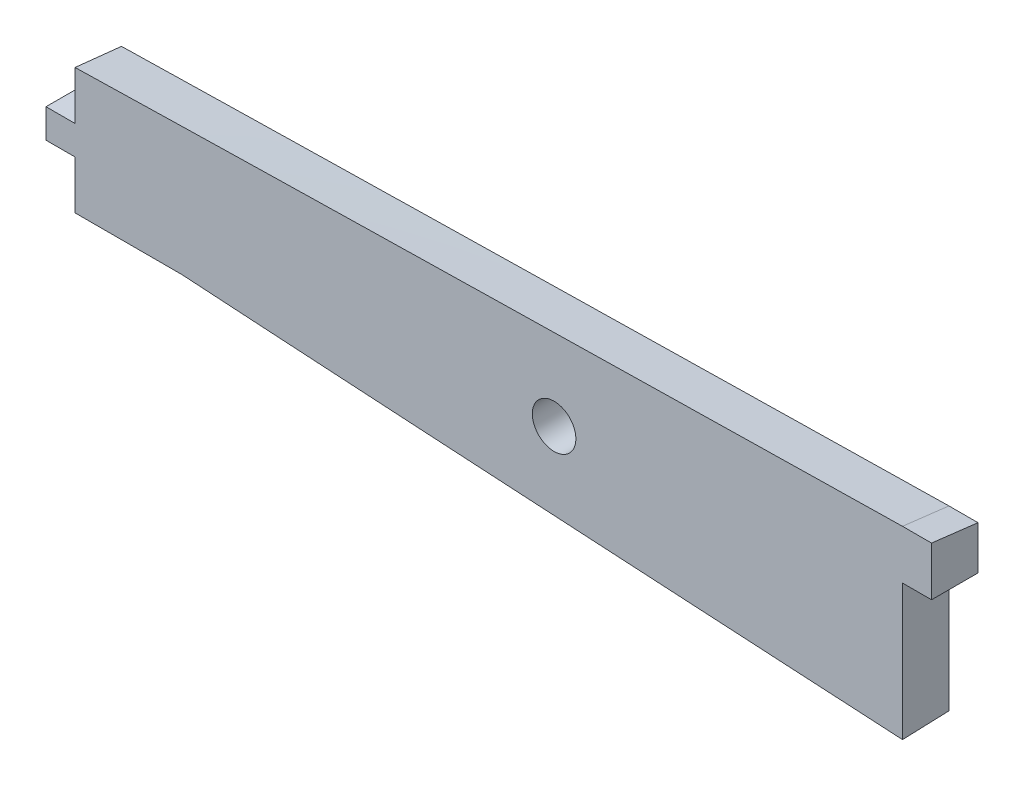
ISO-10303-21;
HEADER;
FILE_DESCRIPTION(('STEP AP214'),'2;1');
FILE_NAME('part.step','',(''),(''),'','','');
FILE_SCHEMA(('AUTOMOTIVE_DESIGN { 1 0 10303 214 1 1 1 1 }'));
ENDSEC;
DATA;
#1=APPLICATION_CONTEXT('core data for automotive mechanical design processes');
#2=APPLICATION_PROTOCOL_DEFINITION('international standard','automotive_design',2000,#1);
#3=PRODUCT_CONTEXT('',#1,'mechanical');
#4=PRODUCT('Part','Part','',(#3));
#5=PRODUCT_RELATED_PRODUCT_CATEGORY('part','',(#4));
#6=PRODUCT_DEFINITION_FORMATION('','',#4);
#7=PRODUCT_DEFINITION_CONTEXT('part definition',#1,'design');
#8=PRODUCT_DEFINITION('design','',#6,#7);
#9=PRODUCT_DEFINITION_SHAPE('','',#8);
#10=(LENGTH_UNIT() NAMED_UNIT(*) SI_UNIT(.MILLI.,.METRE.));
#11=(NAMED_UNIT(*) PLANE_ANGLE_UNIT() SI_UNIT($,.RADIAN.));
#12=(NAMED_UNIT(*) SI_UNIT($,.STERADIAN.) SOLID_ANGLE_UNIT());
#13=UNCERTAINTY_MEASURE_WITH_UNIT(LENGTH_MEASURE(1.E-05),#10,'distance_accuracy_value','');
#14=(GEOMETRIC_REPRESENTATION_CONTEXT(3) GLOBAL_UNCERTAINTY_ASSIGNED_CONTEXT((#13)) GLOBAL_UNIT_ASSIGNED_CONTEXT((#10,
#11,#12)) REPRESENTATION_CONTEXT('',''));
#15=CARTESIAN_POINT('',(0.,0.,0.));
#16=DIRECTION('',(0.,0.,1.));
#17=DIRECTION('',(1.,0.,0.));
#18=AXIS2_PLACEMENT_3D('',#15,#16,#17);
#19=CARTESIAN_POINT('',(-12.7,68.1685296686,5.08000000000001));
#20=DIRECTION('',(-1.,0.,0.));
#21=DIRECTION('',(0.,0.,-1.));
#22=AXIS2_PLACEMENT_3D('',#19,#20,#21);
#23=PLANE('',#22);
#24=DIRECTION('',(0.,-1.14396134734705E-13,1.));
#25=VECTOR('',#24,1.);
#26=CARTESIAN_POINT('',(-12.7,20.3824593467357,-5.07999999999999));
#27=LINE('',#26,#25);
#28=CARTESIAN_POINT('',(-12.7,20.3824593467351,-5.07999999999997));
#29=VERTEX_POINT('',#28);
#30=CARTESIAN_POINT('',(-12.7,20.3824593467345,5.07999999999876));
#31=VERTEX_POINT('',#30);
#32=EDGE_CURVE('E138',#29,#31,#27,.T.);
#33=ORIENTED_EDGE('',*,*,#32,.T.);
#34=DIRECTION('',(0.,-1.,0.));
#35=VECTOR('',#34,1.);
#36=CARTESIAN_POINT('',(-12.7,68.1685296686,5.08000000000001));
#37=LINE('',#36,#35);
#38=CARTESIAN_POINT('',(-12.7,-9.28323172304783,5.07999999999992));
#39=VERTEX_POINT('',#38);
#40=EDGE_CURVE('E146',#31,#39,#37,.T.);
#41=ORIENTED_EDGE('',*,*,#40,.T.);
#42=CARTESIAN_POINT('',(-12.7,-8.90911860618509,-5.08000000000001));
#43=CARTESIAN_POINT('',(-12.7,-9.100340278425,0.00828875850543073));
#44=CARTESIAN_POINT('',(-12.7,-9.28323172304783,5.07999999999983));
#45=B_SPLINE_CURVE_WITH_KNOTS('',2,(#42,#43,#44),.UNSPECIFIED.,.F.,.F.,(3,3),(0.,1.),.UNSPECIFIED.);
#46=CARTESIAN_POINT('',(-12.7,-8.90911860618509,-5.08000000000001));
#47=VERTEX_POINT('',#46);
#48=EDGE_CURVE('E266',#47,#39,#45,.T.);
#49=ORIENTED_EDGE('',*,*,#48,.F.);
#50=DIRECTION('',(0.,-1.,0.));
#51=VECTOR('',#50,1.);
#52=CARTESIAN_POINT('',(-12.7,68.1685296686,-5.07999999999997));
#53=LINE('',#52,#51);
#54=EDGE_CURVE('E156',#29,#47,#53,.T.);
#55=ORIENTED_EDGE('',*,*,#54,.F.);
#56=EDGE_LOOP('',(#33,#41,#49,#55));
#57=FACE_BOUND('',#56,.T.);
#58=ADVANCED_FACE('F36',(#57),#23,.F.);
#59=CARTESIAN_POINT('',(-193.675,68.1685296686,5.08000000000006));
#60=DIRECTION('',(1.,0.,0.));
#61=DIRECTION('',(0.,0.,1.));
#62=AXIS2_PLACEMENT_3D('',#59,#60,#61);
#63=PLANE('',#62);
#64=DIRECTION('',(0.,0.,1.));
#65=VECTOR('',#64,1.);
#66=CARTESIAN_POINT('',(-193.675,16.9384284163652,5.07999999999858));
#67=LINE('',#66,#65);
#68=CARTESIAN_POINT('',(-193.675,16.9384284163648,-5.08000000000006));
#69=VERTEX_POINT('',#68);
#70=CARTESIAN_POINT('',(-193.675,16.9384284163648,5.08000000000006));
#71=VERTEX_POINT('',#70);
#72=EDGE_CURVE('E185',#69,#71,#67,.T.);
#73=ORIENTED_EDGE('',*,*,#72,.T.);
#74=DIRECTION('',(0.,-1.,0.));
#75=VECTOR('',#74,1.);
#76=CARTESIAN_POINT('',(-193.675,68.1685296686,5.08000000000006));
#77=LINE('',#76,#75);
#78=CARTESIAN_POINT('',(-193.675,27.5457610045795,5.08000000000006));
#79=VERTEX_POINT('',#78);
#80=EDGE_CURVE('E246',#79,#71,#77,.T.);
#81=ORIENTED_EDGE('',*,*,#80,.F.);
#82=CARTESIAN_POINT('',(-193.675,27.5457610045795,5.08000000000007));
#83=CARTESIAN_POINT('',(-193.675,27.4553730032048,4.23335396970068));
#84=CARTESIAN_POINT('',(-193.675,27.3650457787327,3.38670145335956));
#85=CARTESIAN_POINT('',(-193.675,27.1844942933383,1.69338545022722));
#86=CARTESIAN_POINT('',(-193.675,27.0942700324148,0.846721963436124));
#87=CARTESIAN_POINT('',(-193.675,26.9139058821622,-0.846613994891505));
#88=CARTESIAN_POINT('',(-193.675,26.8237659928328,-1.69328646642802));
#89=CARTESIAN_POINT('',(-193.675,26.6435522555936,-3.38663844667215));
#90=CARTESIAN_POINT('',(-193.675,26.5534784076844,-4.23331795537983));
#91=CARTESIAN_POINT('',(-193.675,26.4634284163438,-5.08000000000006));
#92=B_SPLINE_CURVE_WITH_KNOTS('',3,(#82,#83,#84,#85,#86,#87,#88,#89,#90,#91),.UNSPECIFIED.,.F.,
.F.,(4,2,2,2,4),(0.,2.55437181973439,5.10874361405029,7.66311540558675,10.2174872225417),.UNSPECIFIED.);
#93=CARTESIAN_POINT('',(-193.675,26.4634284163438,-5.08000000000006));
#94=VERTEX_POINT('',#93);
#95=EDGE_CURVE('E49',#79,#94,#92,.T.);
#96=ORIENTED_EDGE('',*,*,#95,.T.);
#97=DIRECTION('',(0.,-1.,0.));
#98=VECTOR('',#97,1.);
#99=CARTESIAN_POINT('',(-193.675,68.1685296686,-5.08000000000006));
#100=LINE('',#99,#98);
#101=EDGE_CURVE('E453',#94,#69,#100,.T.);
#102=ORIENTED_EDGE('',*,*,#101,.T.);
#103=EDGE_LOOP('',(#73,#81,#96,#102));
#104=FACE_BOUND('',#103,.T.);
#105=ADVANCED_FACE('F216',(#104),#63,.F.);
#106=DIRECTION('',(0.,0.,-1.));
#107=VECTOR('',#106,1.);
#108=CARTESIAN_POINT('',(-193.675,10.5884284163652,5.07999999999914));
#109=LINE('',#108,#107);
#110=CARTESIAN_POINT('',(-193.675,10.5884284163648,5.08000000000006));
#111=VERTEX_POINT('',#110);
#112=CARTESIAN_POINT('',(-193.675,10.5884284163643,-5.08000000000093));
#113=VERTEX_POINT('',#112);
#114=EDGE_CURVE('E459',#111,#113,#109,.T.);
#115=ORIENTED_EDGE('',*,*,#114,.T.);
#116=CARTESIAN_POINT('',(-193.675,0.,-5.08000000000006));
#117=VERTEX_POINT('',#116);
#118=EDGE_CURVE('E252',#113,#117,#100,.T.);
#119=ORIENTED_EDGE('',*,*,#118,.T.);
#120=DIRECTION('',(0.,0.,-1.));
#121=VECTOR('',#120,1.);
#122=CARTESIAN_POINT('',(-193.675,0.,5.08000000000006));
#123=LINE('',#122,#121);
#124=CARTESIAN_POINT('',(-193.675,0.,5.08000000000006));
#125=VERTEX_POINT('',#124);
#126=EDGE_CURVE('E248',#125,#117,#123,.T.);
#127=ORIENTED_EDGE('',*,*,#126,.F.);
#128=EDGE_CURVE('E244',#111,#125,#77,.T.);
#129=ORIENTED_EDGE('',*,*,#128,.F.);
#130=EDGE_LOOP('',(#115,#119,#127,#129));
#131=FACE_BOUND('',#130,.T.);
#132=ADVANCED_FACE('F221',(#131),#63,.F.);
#133=CARTESIAN_POINT('',(-12.7,68.1685296686,5.08000000000001));
#134=DIRECTION('',(0.,0.,-1.));
#135=DIRECTION('',(1.,0.,0.));
#136=AXIS2_PLACEMENT_3D('',#133,#134,#135);
#137=PLANE('',#136);
#138=CARTESIAN_POINT('',(-88.9,11.9607628449315,5.08000000000003));
#139=DIRECTION('',(0.,0.,1.));
#140=DIRECTION('',(1.,0.,0.));
#141=AXIS2_PLACEMENT_3D('',#138,#139,#140);
#142=CIRCLE('',#141,4.76250000000001);
#143=CARTESIAN_POINT('',(-84.1375,11.9607628449315,5.08000000000003));
#144=VERTEX_POINT('',#143);
#145=EDGE_CURVE('E158',#144,#144,#142,.F.);
#146=ORIENTED_EDGE('',*,*,#145,.T.);
#147=EDGE_LOOP('',(#146));
#148=FACE_BOUND('',#147,.T.);
#149=CARTESIAN_POINT('',(-12.7,31.1264588411048,5.08000000000002));
#150=CARTESIAN_POINT('',(-20.240878598146,30.9915007529378,5.08000000000001));
#151=CARTESIAN_POINT('',(-27.781745282566,30.8558698048851,5.08000000000001));
#152=CARTESIAN_POINT('',(-42.8634467129071,30.5826941103659,5.08000000000003));
#153=CARTESIAN_POINT('',(-50.4042814588156,30.4451493632016,5.08000000000004));
#154=CARTESIAN_POINT('',(-65.4859055300961,30.1675780870469,5.08000000000003));
#155=CARTESIAN_POINT('',(-73.0266948554674,30.0275515580145,5.08000000000002));
#156=CARTESIAN_POINT('',(-84.337831258098,29.8150365208587,5.08000000000003));
#157=CARTESIAN_POINT('',(-88.1082015924928,29.7437856448358,5.08000000000004));
#158=CARTESIAN_POINT('',(-95.6489244022193,29.600330419434,5.08000000000002));
#159=CARTESIAN_POINT('',(-99.4192768775498,29.5281260699865,5.08));
#160=CARTESIAN_POINT('',(-108.216767514312,29.3583681854645,5.08));
#161=CARTESIAN_POINT('',(-113.243897453606,29.2603877856525,5.08000000000003));
#162=CARTESIAN_POINT('',(-123.298110561089,29.0620619339715,5.08000000000005));
#163=CARTESIAN_POINT('',(-128.325193729279,28.9617164821885,5.08000000000004));
#164=CARTESIAN_POINT('',(-138.379300891383,28.7581477626605,5.08000000000004));
#165=CARTESIAN_POINT('',(-143.406324885308,28.6549244955037,5.08000000000006));
#166=CARTESIAN_POINT('',(-153.460307894703,28.4449589930916,5.08000000000003));
#167=CARTESIAN_POINT('',(-158.487266910051,28.3382167519671,5.07999999999999));
#168=CARTESIAN_POINT('',(-168.54109255585,28.1204062016917,5.08000000000011));
#169=CARTESIAN_POINT('',(-173.567959186284,28.0093378917542,5.08000000000027));
#170=CARTESIAN_POINT('',(-183.62157553666,27.781834581265,5.07999999999984));
#171=CARTESIAN_POINT('',(-188.648325256487,27.6653995756793,5.07999999999925));
#172=CARTESIAN_POINT('',(-193.675,27.5457610045794,5.0799999999978));
#173=B_SPLINE_CURVE_WITH_KNOTS('',3,(#149,#150,#151,#152,#153,#154,#155,#156,#157,#158,#159,
#160,#161,#162,#163,#164,#165,#166,#167,#168,#169,#170,#171,#172),.UNSPECIFIED.,.F.,.F.,(4,2,2,
2,2,2,2,2,2,2,2,4),(0.,22.6262586494779,45.2525255484199,67.8787928307882,79.1919232579126,
90.5050544986673,105.589308081419,120.673561116489,135.757811068393,150.842086180281,
165.926364035267,181.010656039493),.UNSPECIFIED.);
#174=CARTESIAN_POINT('',(-12.7,31.1264588411048,5.08000000000002));
#175=VERTEX_POINT('',#174);
#176=EDGE_CURVE('E211',#175,#79,#173,.T.);
#177=ORIENTED_EDGE('',*,*,#176,.T.);
#178=ORIENTED_EDGE('',*,*,#80,.T.);
#179=DIRECTION('',(1.,0.,0.));
#180=VECTOR('',#179,1.);
#181=CARTESIAN_POINT('',(-212.006156037713,16.9384284163652,5.07999999999858));
#182=LINE('',#181,#180);
#183=CARTESIAN_POINT('',(-200.025,16.9384284163652,5.07999999999858));
#184=VERTEX_POINT('',#183);
#185=EDGE_CURVE('E455',#184,#71,#182,.T.);
#186=ORIENTED_EDGE('',*,*,#185,.F.);
#187=DIRECTION('',(0.,-1.,0.));
#188=VECTOR('',#187,1.);
#189=CARTESIAN_POINT('',(-200.025,16.9384284163652,5.07999999999858));
#190=LINE('',#189,#188);
#191=CARTESIAN_POINT('',(-200.025,10.5884284163652,5.07999999999914));
#192=VERTEX_POINT('',#191);
#193=EDGE_CURVE('E476',#184,#192,#190,.T.);
#194=ORIENTED_EDGE('',*,*,#193,.T.);
#195=DIRECTION('',(1.,0.,0.));
#196=VECTOR('',#195,1.);
#197=CARTESIAN_POINT('',(-212.006156037713,10.5884284163652,5.07999999999914));
#198=LINE('',#197,#196);
#199=EDGE_CURVE('E458',#192,#111,#198,.T.);
#200=ORIENTED_EDGE('',*,*,#199,.T.);
#201=ORIENTED_EDGE('',*,*,#128,.T.);
#202=DIRECTION('',(-1.,0.,0.));
#203=VECTOR('',#202,1.);
#204=CARTESIAN_POINT('',(-12.7,0.,5.08000000000001));
#205=LINE('',#204,#203);
#206=CARTESIAN_POINT('',(-170.330303370251,0.,5.08));
#207=VERTEX_POINT('',#206);
#208=EDGE_CURVE('E155',#207,#125,#205,.T.);
#209=ORIENTED_EDGE('',*,*,#208,.F.);
#210=CARTESIAN_POINT('',(-12.7,-9.28323172304784,5.08000000000001));
#211=CARTESIAN_POINT('',(-17.0792815650967,-9.03698191603661,5.08000000000001));
#212=CARTESIAN_POINT('',(-21.4585310434305,-8.79016067917864,5.08000000000001));
#213=CARTESIAN_POINT('',(-30.216957671764,-8.29523196966195,5.08000000000002));
#214=CARTESIAN_POINT('',(-34.5961348217576,-8.04712449689711,5.08000000000002));
#215=CARTESIAN_POINT('',(-43.3544079667282,-7.54947997716202,5.08000000000002));
#216=CARTESIAN_POINT('',(-47.7335039617041,-7.29994293017522,5.08000000000002));
#217=CARTESIAN_POINT('',(-56.4915923791214,-6.79926960981277,5.08000000000002));
#218=CARTESIAN_POINT('',(-60.8705848018162,-6.5481333408692,5.08000000000002));
#219=CARTESIAN_POINT('',(-69.6284663624083,-6.0440659889009,5.08000000000003));
#220=CARTESIAN_POINT('',(-74.0073555003059,-5.79113490588101,5.08000000000005));
#221=CARTESIAN_POINT('',(-82.765016940677,-5.28325205309276,5.08000000000001));
#222=CARTESIAN_POINT('',(-87.1437892431421,-5.02830028318045,5.07999999999996));
#223=CARTESIAN_POINT('',(-95.9012417477874,-4.51611178090797,5.07999999999996));
#224=CARTESIAN_POINT('',(-100.279921948708,-4.2588750269942,5.08000000000001));
#225=CARTESIAN_POINT('',(-109.037129403544,-3.74181419578588,5.08000000000006));
#226=CARTESIAN_POINT('',(-113.415656657469,-3.48199011863502,5.08000000000004));
#227=CARTESIAN_POINT('',(-122.172534901833,-2.95939998565597,5.08000000000003));
#228=CARTESIAN_POINT('',(-126.550885892304,-2.69663393035371,5.08000000000004));
#229=CARTESIAN_POINT('',(-135.307396897577,-2.16774367789491,5.08000000000004));
#230=CARTESIAN_POINT('',(-139.685556911836,-1.90161947175008,5.08000000000004));
#231=CARTESIAN_POINT('',(-148.441643134082,-1.36553571840324,5.08000000000004));
#232=CARTESIAN_POINT('',(-152.819569342028,-1.09557617052689,5.08000000000004));
#233=CARTESIAN_POINT('',(-161.575150560845,-0.551243119438708,5.08000000000005));
#234=CARTESIAN_POINT('',(-165.952805571509,-0.276869612897076,5.08000000000006));
#235=CARTESIAN_POINT('',(-170.330303370251,0.,5.08000000000008));
#236=B_SPLINE_CURVE_WITH_KNOTS('',3,(#210,#211,#212,#213,#214,#215,#216,#217,#218,#219,#220,
#221,#222,#223,#224,#225,#226,#227,#228,#229,#230,#231,#232,#233,#234,#235),.UNSPECIFIED.,.F.,
.F.,(4,2,2,2,2,2,2,2,2,2,2,2,4),(0.,13.1585985089891,26.3171981035258,39.4757978503642,
52.6343611454301,65.7929244051206,78.9514886022396,92.1101770523273,105.268864771546,
118.427550138442,131.586270732886,144.744993640969,157.903726476162),.UNSPECIFIED.);
#237=EDGE_CURVE('E150',#39,#207,#236,.T.);
#238=ORIENTED_EDGE('',*,*,#237,.F.);
#239=ORIENTED_EDGE('',*,*,#40,.F.);
#240=DIRECTION('',(-1.,0.,0.));
#241=VECTOR('',#240,1.);
#242=CARTESIAN_POINT('',(8.43712700746934,20.3824593467345,5.07999999999876));
#243=LINE('',#242,#241);
#244=CARTESIAN_POINT('',(-6.35,20.3824593467345,5.07999999999876));
#245=VERTEX_POINT('',#244);
#246=EDGE_CURVE('E134',#245,#31,#243,.T.);
#247=ORIENTED_EDGE('',*,*,#246,.F.);
#248=DIRECTION('',(0.,-1.,-1.16816129368478E-13));
#249=VECTOR('',#248,1.);
#250=CARTESIAN_POINT('',(-6.35,20.3824593467345,5.07999999999876));
#251=LINE('',#250,#249);
#252=CARTESIAN_POINT('',(-6.35,31.1264588411048,5.08000000000002));
#253=VERTEX_POINT('',#252);
#254=EDGE_CURVE('E178',#253,#245,#251,.T.);
#255=ORIENTED_EDGE('',*,*,#254,.F.);
#256=DIRECTION('',(-1.,0.,0.));
#257=VECTOR('',#256,1.);
#258=CARTESIAN_POINT('',(8.43712700746934,31.1264588411048,5.08000000000002));
#259=LINE('',#258,#257);
#260=EDGE_CURVE('E143',#253,#175,#259,.T.);
#261=ORIENTED_EDGE('',*,*,#260,.T.);
#262=EDGE_LOOP('',(#177,#178,#186,#194,#200,#201,#209,#238,#239,#247,#255,#261));
#263=FACE_BOUND('',#262,.T.);
#264=ADVANCED_FACE('F147',(#148,#263),#137,.F.);
#265=CARTESIAN_POINT('',(-12.7,68.1685296686,-5.07999999999997));
#266=DIRECTION('',(0.,0.,1.));
#267=DIRECTION('',(-1.,0.,0.));
#268=AXIS2_PLACEMENT_3D('',#265,#266,#267);
#269=PLANE('',#268);
#270=CARTESIAN_POINT('',(-88.9,11.9607628449315,-5.08));
#271=DIRECTION('',(0.,0.,1.));
#272=DIRECTION('',(1.,0.,0.));
#273=AXIS2_PLACEMENT_3D('',#270,#271,#272);
#274=CIRCLE('',#273,4.76250000000001);
#275=CARTESIAN_POINT('',(-84.1375,11.9607628449315,-5.08));
#276=VERTEX_POINT('',#275);
#277=EDGE_CURVE('E163',#276,#276,#274,.T.);
#278=ORIENTED_EDGE('',*,*,#277,.T.);
#279=EDGE_LOOP('',(#278));
#280=FACE_BOUND('',#279,.T.);
#281=CARTESIAN_POINT('',(-193.675,26.4634284163438,-5.08000000000006));
#282=CARTESIAN_POINT('',(-189.561288744215,26.5528301722815,-5.08000000000006));
#283=CARTESIAN_POINT('',(-185.447545793579,26.6407599051557,-5.08000000000005));
#284=CARTESIAN_POINT('',(-177.220007188514,26.8140969797346,-5.08000000000005));
#285=CARTESIAN_POINT('',(-173.106211534091,26.8995043217341,-5.08000000000004));
#286=CARTESIAN_POINT('',(-164.878579347824,27.0682182471171,-5.08000000000004));
#287=CARTESIAN_POINT('',(-160.764742816003,27.151524831574,-5.08000000000005));
#288=CARTESIAN_POINT('',(-152.537034063824,27.3163614696467,-5.08000000000003));
#289=CARTESIAN_POINT('',(-148.423161843465,27.397891523203,-5.08000000000001));
#290=CARTESIAN_POINT('',(-136.081505515301,27.6402430379542,-5.07999999999998));
#291=CARTESIAN_POINT('',(-127.853677455265,27.7988259404883,-5.08));
#292=CARTESIAN_POINT('',(-111.397938020904,28.1117098225093,-5.08000000000004));
#293=CARTESIAN_POINT('',(-103.170026646557,28.2660108008205,-5.08000000000005));
#294=CARTESIAN_POINT('',(-88.0886347910034,28.545978357519,-5.08000000000004));
#295=CARTESIAN_POINT('',(-81.2351631578599,28.6721224038424,-5.08000000000001));
#296=CARTESIAN_POINT('',(-67.5281893168122,28.9227415474247,-5.07999999999998));
#297=CARTESIAN_POINT('',(-60.6746871089077,29.0472166446614,-5.07999999999999));
#298=CARTESIAN_POINT('',(-46.9676640365372,29.2948830815499,-5.07999999999999));
#299=CARTESIAN_POINT('',(-40.1141431720866,29.4180744220467,-5.07999999999998));
#300=CARTESIAN_POINT('',(-26.4070836797305,29.663451533301,-5.07999999999997));
#301=CARTESIAN_POINT('',(-19.5535450518257,29.7856373040944,-5.07999999999997));
#302=CARTESIAN_POINT('',(-12.7,29.9074593467357,-5.07999999999996));
#303=B_SPLINE_CURVE_WITH_KNOTS('',3,(#281,#282,#283,#284,#285,#286,#287,#288,#289,#290,#291,
#292,#293,#294,#295,#296,#297,#298,#299,#300,#301,#302),.UNSPECIFIED.,.F.,.F.,(4,2,2,2,2,2,2,2,
2,2,4),(0.,12.3440471339799,24.6880928257615,37.032132211091,49.3761720098245,74.0642387492005,
98.7523122667729,119.316209304779,139.880106614286,160.443990387034,181.007873426194),.UNSPECIFIED.);
#304=CARTESIAN_POINT('',(-12.7,29.9074593467357,-5.07999999999997));
#305=VERTEX_POINT('',#304);
#306=EDGE_CURVE('E11',#94,#305,#303,.T.);
#307=ORIENTED_EDGE('',*,*,#306,.T.);
#308=DIRECTION('',(-1.,0.,0.));
#309=VECTOR('',#308,1.);
#310=CARTESIAN_POINT('',(8.43712700746934,29.9074593467357,-5.07999999999997));
#311=LINE('',#310,#309);
#312=CARTESIAN_POINT('',(-6.35,29.9074593467357,-5.07999999999997));
#313=VERTEX_POINT('',#312);
#314=EDGE_CURVE('E175',#313,#305,#311,.T.);
#315=ORIENTED_EDGE('',*,*,#314,.F.);
#316=DIRECTION('',(0.,1.,0.));
#317=VECTOR('',#316,1.);
#318=CARTESIAN_POINT('',(-6.35,29.9074593467357,-5.07999999999997));
#319=LINE('',#318,#317);
#320=CARTESIAN_POINT('',(-6.35,20.3824593467357,-5.07999999999999));
#321=VERTEX_POINT('',#320);
#322=EDGE_CURVE('E461',#321,#313,#319,.T.);
#323=ORIENTED_EDGE('',*,*,#322,.F.);
#324=DIRECTION('',(-1.,0.,0.));
#325=VECTOR('',#324,1.);
#326=CARTESIAN_POINT('',(8.43712700746934,20.3824593467357,-5.07999999999999));
#327=LINE('',#326,#325);
#328=EDGE_CURVE('E57',#321,#29,#327,.T.);
#329=ORIENTED_EDGE('',*,*,#328,.T.);
#330=ORIENTED_EDGE('',*,*,#54,.T.);
#331=CARTESIAN_POINT('',(-166.834523953685,0.,-5.08000000000005));
#332=CARTESIAN_POINT('',(-162.553927522823,-0.262748115540724,-5.08000000000004));
#333=CARTESIAN_POINT('',(-158.273207077128,-0.523468305699599,-5.08000000000004));
#334=CARTESIAN_POINT('',(-149.711552434467,-1.04133920614492,-5.08000000000003));
#335=CARTESIAN_POINT('',(-145.430618237612,-1.29848991827947,-5.08000000000003));
#336=CARTESIAN_POINT('',(-136.868566448249,-1.80970847419397,-5.08000000000003));
#337=CARTESIAN_POINT('',(-132.587448855763,-2.06377631834121,-5.08000000000003));
#338=CARTESIAN_POINT('',(-124.025062577409,-2.56922092674556,-5.08000000000002));
#339=CARTESIAN_POINT('',(-119.743793891827,-2.82059769582711,-5.08000000000002));
#340=CARTESIAN_POINT('',(-111.181118573076,-3.3209986865399,-5.08000000000002));
#341=CARTESIAN_POINT('',(-106.899711939892,-3.57002290788271,-5.08000000000002));
#342=CARTESIAN_POINT('',(-98.3367788542299,-4.06600484386289,-5.08000000000001));
#343=CARTESIAN_POINT('',(-94.0552524017481,-4.31296255842116,-5.08));
#344=CARTESIAN_POINT('',(-85.4920552473962,-4.80505821615959,-5.07999999999999));
#345=CARTESIAN_POINT('',(-81.2103845445587,-5.05019614249812,-5.08));
#346=CARTESIAN_POINT('',(-72.6469513383155,-5.53885913351724,-5.08));
#347=CARTESIAN_POINT('',(-68.3651888349144,-5.7823841982772,-5.07999999999999));
#348=CARTESIAN_POINT('',(-59.801582587974,-6.26800143124519,-5.07999999999999));
#349=CARTESIAN_POINT('',(-55.5197388444346,-6.51009359945201,-5.07999999999999));
#350=CARTESIAN_POINT('',(-46.9559713699736,-6.99300048496102,-5.07999999999998));
#351=CARTESIAN_POINT('',(-42.6740476389184,-7.23381519989334,-5.07999999999998));
#352=CARTESIAN_POINT('',(-34.1101361132548,-7.71430203178304,-5.07999999999998));
#353=CARTESIAN_POINT('',(-29.8281483186468,-7.953974148748,-5.07999999999997));
#354=CARTESIAN_POINT('',(-21.2641154892802,-8.43228955233803,-5.07999999999998));
#355=CARTESIAN_POINT('',(-16.9820704545245,-8.67093283901732,-5.08));
#356=CARTESIAN_POINT('',(-12.7,-8.90911860618509,-5.08000000000005));
#357=B_SPLINE_CURVE_WITH_KNOTS('',3,(#331,#332,#333,#334,#335,#336,#337,#338,#339,#340,#341,
#342,#343,#344,#345,#346,#347,#348,#349,#350,#351,#352,#353,#354,#355,#356),.UNSPECIFIED.,.F.,
.F.,(4,2,2,2,2,2,2,2,2,2,2,2,4),(0.,12.8659570886167,25.7319075155837,38.5978564096761,
51.4637822343748,64.3297096364689,77.1956375311051,90.0616843482072,102.927730532119,
115.793776726895,128.659846781837,141.525916751466,154.391986043261),.UNSPECIFIED.);
#358=CARTESIAN_POINT('',(-166.834523953685,0.,-5.08000000000004));
#359=VERTEX_POINT('',#358);
#360=EDGE_CURVE('E267',#359,#47,#357,.T.);
#361=ORIENTED_EDGE('',*,*,#360,.F.);
#362=DIRECTION('',(1.,0.,0.));
#363=VECTOR('',#362,1.);
#364=CARTESIAN_POINT('',(-12.7,0.,-5.07999999999997));
#365=LINE('',#364,#363);
#366=EDGE_CURVE('E235',#117,#359,#365,.T.);
#367=ORIENTED_EDGE('',*,*,#366,.F.);
#368=ORIENTED_EDGE('',*,*,#118,.F.);
#369=DIRECTION('',(1.,0.,0.));
#370=VECTOR('',#369,1.);
#371=CARTESIAN_POINT('',(-212.006156037713,10.5884284163643,-5.08000000000093));
#372=LINE('',#371,#370);
#373=CARTESIAN_POINT('',(-200.025,10.5884284163643,-5.08000000000093));
#374=VERTEX_POINT('',#373);
#375=EDGE_CURVE('E193',#374,#113,#372,.T.);
#376=ORIENTED_EDGE('',*,*,#375,.F.);
#377=DIRECTION('',(0.,1.,0.));
#378=VECTOR('',#377,1.);
#379=CARTESIAN_POINT('',(-200.025,10.5884284163643,-5.08000000000093));
#380=LINE('',#379,#378);
#381=CARTESIAN_POINT('',(-200.025,16.9384284163643,-5.08000000000145));
#382=VERTEX_POINT('',#381);
#383=EDGE_CURVE('E263',#374,#382,#380,.T.);
#384=ORIENTED_EDGE('',*,*,#383,.T.);
#385=DIRECTION('',(1.,0.,0.));
#386=VECTOR('',#385,1.);
#387=CARTESIAN_POINT('',(-212.006156037713,16.9384284163643,-5.08000000000145));
#388=LINE('',#387,#386);
#389=EDGE_CURVE('E64',#382,#69,#388,.T.);
#390=ORIENTED_EDGE('',*,*,#389,.T.);
#391=ORIENTED_EDGE('',*,*,#101,.F.);
#392=EDGE_LOOP('',(#307,#315,#323,#329,#330,#361,#367,#368,#376,#384,#390,#391));
#393=FACE_BOUND('',#392,.T.);
#394=ADVANCED_FACE('F223',(#280,#393),#269,.F.);
#395=CARTESIAN_POINT('',(-12.7,0.,0.));
#396=DIRECTION('',(0.,-1.,0.));
#397=DIRECTION('',(0.,0.,-1.));
#398=AXIS2_PLACEMENT_3D('',#395,#396,#397);
#399=PLANE('',#398);
#400=CARTESIAN_POINT('',(-166.834523953685,0.,-5.08000000000006));
#401=CARTESIAN_POINT('',(-166.990891784238,0.,-4.66038758436538));
#402=CARTESIAN_POINT('',(-167.145914818555,0.,-4.24027412125904));
#403=CARTESIAN_POINT('',(-167.453257833864,0.,-3.39911657189614));
#404=CARTESIAN_POINT('',(-167.605578136005,0.,-2.9780726029829));
#405=CARTESIAN_POINT('',(-167.907527710132,0.,-2.13505840385131));
#406=CARTESIAN_POINT('',(-168.057157193739,0.,-1.7130882494275));
#407=CARTESIAN_POINT('',(-168.353738434179,0.,-0.868226437468786));
#408=CARTESIAN_POINT('',(-168.500690294965,0.,-0.445334816424175));
#409=CARTESIAN_POINT('',(-168.791930039128,0.,0.401363957899498));
#410=CARTESIAN_POINT('',(-168.936217926797,0.,0.825171109702779));
#411=CARTESIAN_POINT('',(-169.222145140947,0.,1.67369685562496));
#412=CARTESIAN_POINT('',(-169.363784360733,0.,2.09841548569566));
#413=CARTESIAN_POINT('',(-169.644430062353,0.,2.94875894005456));
#414=CARTESIAN_POINT('',(-169.783436334754,0.,3.37438383345951));
#415=CARTESIAN_POINT('',(-170.058833108172,0.,4.22653429171249));
#416=CARTESIAN_POINT('',(-170.195223299914,0.,4.65305995651396));
#417=CARTESIAN_POINT('',(-170.330303370251,0.,5.07999999999999));
#418=B_SPLINE_CURVE_WITH_KNOTS('',3,(#400,#401,#402,#403,#404,#405,#406,#407,#408,#409,#410,
#411,#412,#413,#414,#415,#416,#417),.UNSPECIFIED.,.F.,.F.,(4,2,2,2,2,2,2,2,4),(0.,
1.34339971543268,2.68663871932462,4.02977161793419,5.37285226121895,6.71593074114991,
8.05906320779163,9.40230206696948,10.7456987580959),.UNSPECIFIED.);
#419=EDGE_CURVE('E260',#359,#207,#418,.T.);
#420=ORIENTED_EDGE('',*,*,#419,.T.);
#421=ORIENTED_EDGE('',*,*,#208,.T.);
#422=ORIENTED_EDGE('',*,*,#126,.T.);
#423=ORIENTED_EDGE('',*,*,#366,.T.);
#424=EDGE_LOOP('',(#420,#421,#422,#423));
#425=FACE_BOUND('',#424,.T.);
#426=ADVANCED_FACE('F257',(#425),#399,.T.);
#427=CARTESIAN_POINT('',(-12.7,3.76640621989611,-241.3));
#428=CARTESIAN_POINT('',(-193.675,8.69313035782715,-164.333003978403));
#429=CARTESIAN_POINT('',(-12.7,13.1710087068932,-169.512198054911));
#430=CARTESIAN_POINT('',(-193.675,13.8921825252803,-119.662610613001));
#431=CARTESIAN_POINT('',(-12.7,21.0550575782133,-78.8082599981825));
#432=CARTESIAN_POINT('',(-193.675,19.33371338101,-72.3769229623819));
#433=CARTESIAN_POINT('',(-12.7,37.1235261113863,55.6101587487718));
#434=CARTESIAN_POINT('',(-193.675,28.6507060178125,15.6276355346142));
#435=CARTESIAN_POINT('',(-12.7,48.7977663222177,129.426856504391));
#436=CARTESIAN_POINT('',(-193.675,33.9284348276645,64.5497023457835));
#437=CARTESIAN_POINT('',(-12.7,57.5998085231161,198.009320440341));
#438=CARTESIAN_POINT('',(-193.675,38.0813427594087,95.1955572914661));
#439=CARTESIAN_POINT('',(-12.7,62.9543851616648,247.036281870022));
#440=CARTESIAN_POINT('',(-193.675,40.072039815151,117.202001979545));
#441=CARTESIAN_POINT('',(-12.7,66.1525245092423,291.989522693939));
#442=CARTESIAN_POINT('',(-193.675,41.1499185194115,137.241930839791));
#443=CARTESIAN_POINT('',(-12.7,68.1675296686,352.543352943217));
#444=CARTESIAN_POINT('',(-193.675,43.3111951964629,164.012369139284));
#445=CARTESIAN_POINT('',(-12.7,67.7183696879014,410.109595972467));
#446=CARTESIAN_POINT('',(-193.675,43.8548371209846,189.230485440772));
#447=CARTESIAN_POINT('',(-12.7,63.2094386266616,467.82184250888));
#448=CARTESIAN_POINT('',(-193.675,40.1916457914026,215.197160236647));
#449=CARTESIAN_POINT('',(-12.7,57.956184881224,507.350823143271));
#450=CARTESIAN_POINT('',(-193.675,36.7387215138955,233.332717966986));
#451=CARTESIAN_POINT('',(-12.7,54.7487461076087,526.308273351952));
#452=CARTESIAN_POINT('',(-193.675,34.8156235896686,242.201701799802));
#453=CARTESIAN_POINT('',(-12.7,50.2039147105371,546.352546318645));
#454=CARTESIAN_POINT('',(-193.675,32.6078504037563,251.794049093099));
#455=CARTESIAN_POINT('',(-12.7,44.0113074578187,566.914559376086));
#456=CARTESIAN_POINT('',(-193.675,30.0023301395098,261.857755720266));
#457=CARTESIAN_POINT('',(-12.7,31.2937438611368,594.054164436425));
#458=CARTESIAN_POINT('',(-193.675,23.0591377393112,275.21582052234));
#459=CARTESIAN_POINT('',(-12.7,19.9797534020256,609.754137799728));
#460=CARTESIAN_POINT('',(-193.675,16.9218526728062,283.327395290058));
#461=CARTESIAN_POINT('',(-12.7,13.2914062198966,617.022547788667));
#462=CARTESIAN_POINT('',(-193.675,13.2914062198966,287.066868946793));
#463=B_SPLINE_SURFACE_WITH_KNOTS('',3,1,((#427,#428),(#429,#430),(#431,#432),(#433,#434),(#435,
#436),(#437,#438),(#439,#440),(#441,#442),(#443,#444),(#445,#446),(#447,#448),(#449,#450),(#451,
#452),(#453,#454),(#455,#456),(#457,#458),(#459,#460),(#461,#462)),.UNSPECIFIED.,.F.,.F.,.F.,(4,
1,1,1,1,1,1,1,1,1,1,1,1,1,1,4),(2,2),(0.,0.247403676163197,0.308401542794999,0.462108507234246,
0.504395117820794,0.542913331738732,0.627983171442133,0.653401948280027,0.743134379497065,
0.818760812058344,0.850169972641487,0.882434425471212,0.887176210845698,0.924179621726545,
0.960505119713505,1.),(0.,1.),.UNSPECIFIED.);
#464=CARTESIAN_POINT('',(-12.7,31.1264588411048,5.08000000000003));
#465=CARTESIAN_POINT('',(-12.7,31.0234962481061,4.23349930580334));
#466=CARTESIAN_POINT('',(-12.7,30.9208895962421,3.38695533199301));
#467=CARTESIAN_POINT('',(-12.7,30.7163715506977,1.69378395349765));
#468=CARTESIAN_POINT('',(-12.7,30.6144601565709,0.847156548866551));
#469=CARTESIAN_POINT('',(-12.7,30.4113158710111,-0.846179643515562));
#470=CARTESIAN_POINT('',(-12.7,30.3100829795728,-1.69288843126593));
#471=CARTESIAN_POINT('',(-12.7,30.1082789761446,-3.38638542084281));
#472=CARTESIAN_POINT('',(-12.7,30.0077078645798,-4.23317362271998));
#473=CARTESIAN_POINT('',(-12.7,29.9074593467357,-5.07999999999996));
#474=B_SPLINE_CURVE_WITH_KNOTS('',3,(#464,#465,#466,#467,#468,#469,#470,#471,#472,#473),
.UNSPECIFIED.,.F.,.F.,(4,2,2,2,4),(0.,2.55821851976493,5.11643539656185,7.67465225309253,
10.2328707525912),.UNSPECIFIED.);
#475=EDGE_CURVE('E198',#175,#305,#474,.T.);
#476=ORIENTED_EDGE('',*,*,#475,.T.);
#477=ORIENTED_EDGE('',*,*,#306,.F.);
#478=ORIENTED_EDGE('',*,*,#95,.F.);
#479=ORIENTED_EDGE('',*,*,#176,.F.);
#480=EDGE_LOOP('',(#476,#477,#478,#479));
#481=FACE_BOUND('',#480,.T.);
#482=ADVANCED_FACE('F38',(#481),#463,.F.);
#483=CARTESIAN_POINT('',(-12.7,13.2914062198968,617.022547788667));
#484=CARTESIAN_POINT('',(-193.675,13.2914062198967,287.066868946793));
#485=CARTESIAN_POINT('',(-12.7,-1.6346618460275,579.732083241401));
#486=CARTESIAN_POINT('',(-193.675,7.90414132716936,266.665101534965));
#487=CARTESIAN_POINT('',(-12.7,-7.63985071848049,493.124189486326));
#488=CARTESIAN_POINT('',(-193.675,0.681716153609975,218.41528803322));
#489=CARTESIAN_POINT('',(-12.7,-11.5456493437354,383.35644074039));
#490=CARTESIAN_POINT('',(-193.675,0.694296632013353,161.799137472671));
#491=CARTESIAN_POINT('',(-12.7,-15.7692195959272,130.463845401109));
#492=CARTESIAN_POINT('',(-193.675,0.769058525041147,31.7030236612414));
#493=CARTESIAN_POINT('',(-12.7,-8.62268129918264,-59.4070577204985));
#494=CARTESIAN_POINT('',(-193.675,1.49966506495164,-70.1666512266198));
#495=CARTESIAN_POINT('',(-12.7,3.76640621989611,-241.3));
#496=CARTESIAN_POINT('',(-193.675,8.69313035782715,-164.333003978403));
#497=B_SPLINE_SURFACE_WITH_KNOTS('',3,1,((#483,#484),(#485,#486),(#487,#488),(#489,#490),(#491,
#492),(#493,#494),(#495,#496)),.UNSPECIFIED.,.F.,.F.,.F.,(4,1,1,1,4),(2,2),(0.,
0.138221334267563,0.3235363097206,0.374686955614901,1.),(0.,1.),.UNSPECIFIED.);
#498=ORIENTED_EDGE('',*,*,#360,.T.);
#499=ORIENTED_EDGE('',*,*,#48,.T.);
#500=ORIENTED_EDGE('',*,*,#237,.T.);
#501=ORIENTED_EDGE('',*,*,#419,.F.);
#502=EDGE_LOOP('',(#498,#499,#500,#501));
#503=FACE_BOUND('',#502,.T.);
#504=ADVANCED_FACE('F265',(#503),#497,.F.);
#505=CARTESIAN_POINT('',(-212.006156037713,10.5884284163652,5.07999999999914));
#506=DIRECTION('',(0.,1.,0.));
#507=DIRECTION('',(0.,0.,1.));
#508=AXIS2_PLACEMENT_3D('',#505,#506,#507);
#509=PLANE('',#508);
#510=DIRECTION('',(0.,0.,-1.));
#511=VECTOR('',#510,1.);
#512=CARTESIAN_POINT('',(-200.025,10.5884284163652,5.07999999999914));
#513=LINE('',#512,#511);
#514=EDGE_CURVE('E475',#192,#374,#513,.T.);
#515=ORIENTED_EDGE('',*,*,#514,.T.);
#516=ORIENTED_EDGE('',*,*,#375,.T.);
#517=ORIENTED_EDGE('',*,*,#114,.F.);
#518=ORIENTED_EDGE('',*,*,#199,.F.);
#519=EDGE_LOOP('',(#515,#516,#517,#518));
#520=FACE_BOUND('',#519,.T.);
#521=ADVANCED_FACE('F307',(#520),#509,.F.);
#522=CARTESIAN_POINT('',(-212.006156037713,16.9384284163652,5.07999999999858));
#523=DIRECTION('',(0.,-1.,0.));
#524=DIRECTION('',(0.,0.,-1.));
#525=AXIS2_PLACEMENT_3D('',#522,#523,#524);
#526=PLANE('',#525);
#527=DIRECTION('',(0.,0.,1.));
#528=VECTOR('',#527,1.);
#529=CARTESIAN_POINT('',(-200.025,16.9384284163652,5.07999999999858));
#530=LINE('',#529,#528);
#531=EDGE_CURVE('E189',#382,#184,#530,.T.);
#532=ORIENTED_EDGE('',*,*,#531,.T.);
#533=ORIENTED_EDGE('',*,*,#185,.T.);
#534=ORIENTED_EDGE('',*,*,#72,.F.);
#535=ORIENTED_EDGE('',*,*,#389,.F.);
#536=EDGE_LOOP('',(#532,#533,#534,#535));
#537=FACE_BOUND('',#536,.T.);
#538=ADVANCED_FACE('F305',(#537),#526,.F.);
#539=CARTESIAN_POINT('',(-200.025,0.900951429124184,61.6633497114729));
#540=DIRECTION('',(-1.,0.,0.));
#541=DIRECTION('',(0.,0.,-1.));
#542=AXIS2_PLACEMENT_3D('',#539,#540,#541);
#543=PLANE('',#542);
#544=ORIENTED_EDGE('',*,*,#531,.F.);
#545=ORIENTED_EDGE('',*,*,#383,.F.);
#546=ORIENTED_EDGE('',*,*,#514,.F.);
#547=ORIENTED_EDGE('',*,*,#193,.F.);
#548=EDGE_LOOP('',(#544,#545,#546,#547));
#549=FACE_BOUND('',#548,.T.);
#550=ADVANCED_FACE('F302',(#549),#543,.T.);
#551=CARTESIAN_POINT('',(8.43712700746934,20.3824593467357,-5.07999999999999));
#552=DIRECTION('',(0.,1.,1.14396134734705E-13));
#553=DIRECTION('',(0.,-1.14396134734705E-13,1.));
#554=AXIS2_PLACEMENT_3D('',#551,#552,#553);
#555=PLANE('',#554);
#556=ORIENTED_EDGE('',*,*,#246,.T.);
#557=ORIENTED_EDGE('',*,*,#32,.F.);
#558=ORIENTED_EDGE('',*,*,#328,.F.);
#559=DIRECTION('',(0.,1.14396134734705E-13,-1.));
#560=VECTOR('',#559,1.);
#561=CARTESIAN_POINT('',(-6.35,20.3824593467357,-5.07999999999999));
#562=LINE('',#561,#560);
#563=EDGE_CURVE('E139',#245,#321,#562,.T.);
#564=ORIENTED_EDGE('',*,*,#563,.F.);
#565=EDGE_LOOP('',(#556,#557,#558,#564));
#566=FACE_BOUND('',#565,.T.);
#567=ADVANCED_FACE('F136',(#566),#555,.F.);
#568=CARTESIAN_POINT('',(8.43712700746934,31.1264588411048,5.08000000000002));
#569=CARTESIAN_POINT('',(8.43712700746934,30.7147534493723,1.6951893185686));
#570=CARTESIAN_POINT('',(8.43712700746934,30.3085908353275,-1.69153354386451));
#571=CARTESIAN_POINT('',(8.43712700746934,29.9074593467357,-5.07999999999997));
#572=B_SPLINE_CURVE_WITH_KNOTS('',3,(#568,#569,#570,#571),.UNSPECIFIED.,.F.,.F.,(4,4),
(0.269771877436496,0.281416192604098),.UNSPECIFIED.);
#573=DIRECTION('',(-1.,0.,0.));
#574=VECTOR('',#573,1.);
#575=SURFACE_OF_LINEAR_EXTRUSION('',#572,#574);
#576=ORIENTED_EDGE('',*,*,#314,.T.);
#577=ORIENTED_EDGE('',*,*,#475,.F.);
#578=ORIENTED_EDGE('',*,*,#260,.F.);
#579=CARTESIAN_POINT('',(-6.34999999999998,31.1264588411048,5.08000000000002));
#580=CARTESIAN_POINT('',(-6.34999999999998,30.7147534493723,1.6951893185686));
#581=CARTESIAN_POINT('',(-6.34999999999998,30.3085908353275,-1.69153354386451));
#582=CARTESIAN_POINT('',(-6.34999999999998,29.9074593467357,-5.07999999999997));
#583=B_SPLINE_CURVE_WITH_KNOTS('',3,(#579,#580,#581,#582),.UNSPECIFIED.,.F.,.F.,(4,4),
(0.269771877436496,0.281416192604098),.UNSPECIFIED.);
#584=EDGE_CURVE('E451',#313,#253,#583,.F.);
#585=ORIENTED_EDGE('',*,*,#584,.F.);
#586=EDGE_LOOP('',(#576,#577,#578,#585));
#587=FACE_BOUND('',#586,.T.);
#588=ADVANCED_FACE('F314',(#587),#575,.T.);
#589=CARTESIAN_POINT('',(-6.35,-13.2466380621064,189.824533969966));
#590=DIRECTION('',(-1.,0.,0.));
#591=DIRECTION('',(0.,0.,-1.));
#592=AXIS2_PLACEMENT_3D('',#589,#590,#591);
#593=PLANE('',#592);
#594=ORIENTED_EDGE('',*,*,#322,.T.);
#595=ORIENTED_EDGE('',*,*,#584,.T.);
#596=ORIENTED_EDGE('',*,*,#254,.T.);
#597=ORIENTED_EDGE('',*,*,#563,.T.);
#598=EDGE_LOOP('',(#594,#595,#596,#597));
#599=FACE_BOUND('',#598,.T.);
#600=ADVANCED_FACE('F317',(#599),#593,.F.);
#601=CARTESIAN_POINT('',(-88.9,11.9607628449315,5.08105000000011));
#602=DIRECTION('',(0.,0.,-1.));
#603=DIRECTION('',(1.,0.,0.));
#604=AXIS2_PLACEMENT_3D('',#601,#602,#603);
#605=CYLINDRICAL_SURFACE('',#604,4.76250000000001);
#606=ORIENTED_EDGE('',*,*,#277,.F.);
#607=EDGE_LOOP('',(#606));
#608=FACE_BOUND('',#607,.T.);
#609=ORIENTED_EDGE('',*,*,#145,.F.);
#610=EDGE_LOOP('',(#609));
#611=FACE_BOUND('',#610,.T.);
#612=ADVANCED_FACE('F323',(#608,#611),#605,.F.);
#613=CLOSED_SHELL('',(#58,#105,#132,#264,#394,#426,#482,#504,#521,#538,#550,#567,#588,#600,#612));
#614=MANIFOLD_SOLID_BREP('B2',#613);
#615=ADVANCED_BREP_SHAPE_REPRESENTATION('',(#18,#614),#14);
#616=SHAPE_DEFINITION_REPRESENTATION(#9,#615);
ENDSEC;
END-ISO-10303-21;
